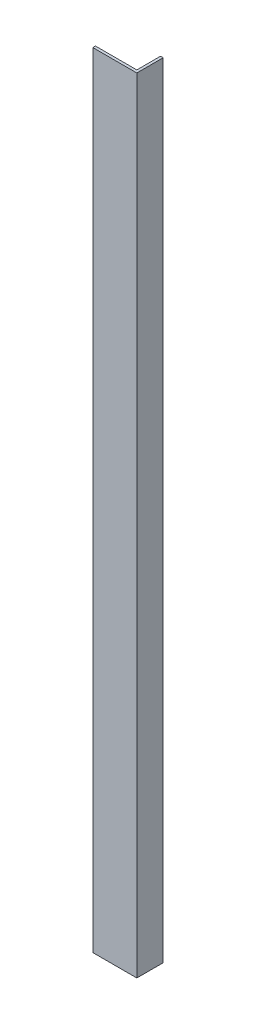
ISO-10303-21;
HEADER;
FILE_DESCRIPTION(('STEP AP214'),'2;1');
FILE_NAME('part.step','',(''),(''),'','','');
FILE_SCHEMA(('AUTOMOTIVE_DESIGN { 1 0 10303 214 1 1 1 1 }'));
ENDSEC;
DATA;
#1=APPLICATION_CONTEXT('core data for automotive mechanical design processes');
#2=APPLICATION_PROTOCOL_DEFINITION('international standard','automotive_design',2000,#1);
#3=PRODUCT_CONTEXT('',#1,'mechanical');
#4=PRODUCT('Part','Part','',(#3));
#5=PRODUCT_RELATED_PRODUCT_CATEGORY('part','',(#4));
#6=PRODUCT_DEFINITION_FORMATION('','',#4);
#7=PRODUCT_DEFINITION_CONTEXT('part definition',#1,'design');
#8=PRODUCT_DEFINITION('design','',#6,#7);
#9=PRODUCT_DEFINITION_SHAPE('','',#8);
#10=(LENGTH_UNIT() NAMED_UNIT(*) SI_UNIT(.MILLI.,.METRE.));
#11=(NAMED_UNIT(*) PLANE_ANGLE_UNIT() SI_UNIT($,.RADIAN.));
#12=(NAMED_UNIT(*) SI_UNIT($,.STERADIAN.) SOLID_ANGLE_UNIT());
#13=UNCERTAINTY_MEASURE_WITH_UNIT(LENGTH_MEASURE(1.E-05),#10,'distance_accuracy_value','');
#14=(GEOMETRIC_REPRESENTATION_CONTEXT(3) GLOBAL_UNCERTAINTY_ASSIGNED_CONTEXT((#13)) GLOBAL_UNIT_ASSIGNED_CONTEXT((#10,
#11,#12)) REPRESENTATION_CONTEXT('',''));
#15=CARTESIAN_POINT('',(0.,0.,0.));
#16=DIRECTION('',(0.,0.,1.));
#17=DIRECTION('',(1.,0.,0.));
#18=AXIS2_PLACEMENT_3D('',#15,#16,#17);
#19=CARTESIAN_POINT('',(25.,890.,-15.));
#20=DIRECTION('',(-1.,0.,0.));
#21=DIRECTION('',(0.,0.,1.));
#22=AXIS2_PLACEMENT_3D('',#19,#20,#21);
#23=PLANE('',#22);
#24=DIRECTION('',(0.,0.,-1.));
#25=VECTOR('',#24,1.);
#26=CARTESIAN_POINT('',(25.,0.,-15.));
#27=LINE('',#26,#25);
#28=CARTESIAN_POINT('',(25.,0.,15.));
#29=VERTEX_POINT('',#28);
#30=CARTESIAN_POINT('',(25.,0.,-15.));
#31=VERTEX_POINT('',#30);
#32=EDGE_CURVE('E116',#29,#31,#27,.T.);
#33=ORIENTED_EDGE('',*,*,#32,.T.);
#34=DIRECTION('',(0.,-1.,0.));
#35=VECTOR('',#34,1.);
#36=CARTESIAN_POINT('',(25.,890.,-15.));
#37=LINE('',#36,#35);
#38=CARTESIAN_POINT('',(25.,890.,-15.));
#39=VERTEX_POINT('',#38);
#40=EDGE_CURVE('E11',#39,#31,#37,.T.);
#41=ORIENTED_EDGE('',*,*,#40,.F.);
#42=DIRECTION('',(0.,0.,-1.));
#43=VECTOR('',#42,1.);
#44=CARTESIAN_POINT('',(25.,890.,-15.));
#45=LINE('',#44,#43);
#46=CARTESIAN_POINT('',(25.,890.,15.));
#47=VERTEX_POINT('',#46);
#48=EDGE_CURVE('E128',#47,#39,#45,.T.);
#49=ORIENTED_EDGE('',*,*,#48,.F.);
#50=DIRECTION('',(0.,-1.,0.));
#51=VECTOR('',#50,1.);
#52=CARTESIAN_POINT('',(25.,890.,15.));
#53=LINE('',#52,#51);
#54=EDGE_CURVE('E112',#47,#29,#53,.T.);
#55=ORIENTED_EDGE('',*,*,#54,.T.);
#56=EDGE_LOOP('',(#33,#41,#49,#55));
#57=FACE_BOUND('',#56,.T.);
#58=ADVANCED_FACE('F33',(#57),#23,.F.);
#59=CARTESIAN_POINT('',(22.,890.,-15.));
#60=DIRECTION('',(0.,0.,1.));
#61=DIRECTION('',(1.,0.,0.));
#62=AXIS2_PLACEMENT_3D('',#59,#60,#61);
#63=PLANE('',#62);
#64=DIRECTION('',(-1.,0.,0.));
#65=VECTOR('',#64,1.);
#66=CARTESIAN_POINT('',(22.,0.,-15.));
#67=LINE('',#66,#65);
#68=CARTESIAN_POINT('',(22.,0.,-15.));
#69=VERTEX_POINT('',#68);
#70=EDGE_CURVE('E119',#31,#69,#67,.T.);
#71=ORIENTED_EDGE('',*,*,#70,.T.);
#72=DIRECTION('',(0.,-1.,0.));
#73=VECTOR('',#72,1.);
#74=CARTESIAN_POINT('',(22.,890.,-15.));
#75=LINE('',#74,#73);
#76=CARTESIAN_POINT('',(22.,890.,-15.));
#77=VERTEX_POINT('',#76);
#78=EDGE_CURVE('E41',#77,#69,#75,.T.);
#79=ORIENTED_EDGE('',*,*,#78,.F.);
#80=DIRECTION('',(-1.,0.,0.));
#81=VECTOR('',#80,1.);
#82=CARTESIAN_POINT('',(22.,890.,-15.));
#83=LINE('',#82,#81);
#84=EDGE_CURVE('E86',#39,#77,#83,.T.);
#85=ORIENTED_EDGE('',*,*,#84,.F.);
#86=ORIENTED_EDGE('',*,*,#40,.T.);
#87=EDGE_LOOP('',(#71,#79,#85,#86));
#88=FACE_BOUND('',#87,.T.);
#89=ADVANCED_FACE('F134',(#88),#63,.F.);
#90=CARTESIAN_POINT('',(22.,890.,-12.));
#91=DIRECTION('',(1.,0.,0.));
#92=DIRECTION('',(0.,0.,-1.));
#93=AXIS2_PLACEMENT_3D('',#90,#91,#92);
#94=PLANE('',#93);
#95=DIRECTION('',(0.,0.,1.));
#96=VECTOR('',#95,1.);
#97=CARTESIAN_POINT('',(22.,0.,-12.));
#98=LINE('',#97,#96);
#99=CARTESIAN_POINT('',(22.,0.,12.));
#100=VERTEX_POINT('',#99);
#101=EDGE_CURVE('E122',#69,#100,#98,.T.);
#102=ORIENTED_EDGE('',*,*,#101,.T.);
#103=DIRECTION('',(0.,-1.,0.));
#104=VECTOR('',#103,1.);
#105=CARTESIAN_POINT('',(22.,890.,12.));
#106=LINE('',#105,#104);
#107=CARTESIAN_POINT('',(22.,890.,12.));
#108=VERTEX_POINT('',#107);
#109=EDGE_CURVE('E107',#108,#100,#106,.T.);
#110=ORIENTED_EDGE('',*,*,#109,.F.);
#111=DIRECTION('',(0.,0.,1.));
#112=VECTOR('',#111,1.);
#113=CARTESIAN_POINT('',(22.,890.,-12.));
#114=LINE('',#113,#112);
#115=EDGE_CURVE('E99',#77,#108,#114,.T.);
#116=ORIENTED_EDGE('',*,*,#115,.F.);
#117=ORIENTED_EDGE('',*,*,#78,.T.);
#118=EDGE_LOOP('',(#102,#110,#116,#117));
#119=FACE_BOUND('',#118,.T.);
#120=ADVANCED_FACE('F133',(#119),#94,.F.);
#121=CARTESIAN_POINT('',(-22.,890.,12.));
#122=DIRECTION('',(0.,0.,1.));
#123=DIRECTION('',(1.,0.,0.));
#124=AXIS2_PLACEMENT_3D('',#121,#122,#123);
#125=PLANE('',#124);
#126=DIRECTION('',(-1.,0.,0.));
#127=VECTOR('',#126,1.);
#128=CARTESIAN_POINT('',(-22.,0.,12.));
#129=LINE('',#128,#127);
#130=CARTESIAN_POINT('',(-25.,0.,12.));
#131=VERTEX_POINT('',#130);
#132=EDGE_CURVE('E106',#100,#131,#129,.T.);
#133=ORIENTED_EDGE('',*,*,#132,.T.);
#134=DIRECTION('',(0.,-1.,0.));
#135=VECTOR('',#134,1.);
#136=CARTESIAN_POINT('',(-25.,890.,12.));
#137=LINE('',#136,#135);
#138=CARTESIAN_POINT('',(-25.,890.,12.));
#139=VERTEX_POINT('',#138);
#140=EDGE_CURVE('E104',#139,#131,#137,.T.);
#141=ORIENTED_EDGE('',*,*,#140,.F.);
#142=DIRECTION('',(-1.,0.,0.));
#143=VECTOR('',#142,1.);
#144=CARTESIAN_POINT('',(-22.,890.,12.));
#145=LINE('',#144,#143);
#146=EDGE_CURVE('E93',#108,#139,#145,.T.);
#147=ORIENTED_EDGE('',*,*,#146,.F.);
#148=ORIENTED_EDGE('',*,*,#109,.T.);
#149=EDGE_LOOP('',(#133,#141,#147,#148));
#150=FACE_BOUND('',#149,.T.);
#151=ADVANCED_FACE('F105',(#150),#125,.F.);
#152=CARTESIAN_POINT('',(-25.,890.,12.));
#153=DIRECTION('',(1.,0.,0.));
#154=DIRECTION('',(0.,0.,-1.));
#155=AXIS2_PLACEMENT_3D('',#152,#153,#154);
#156=PLANE('',#155);
#157=DIRECTION('',(0.,0.,1.));
#158=VECTOR('',#157,1.);
#159=CARTESIAN_POINT('',(-25.,0.,12.));
#160=LINE('',#159,#158);
#161=CARTESIAN_POINT('',(-25.,0.,15.));
#162=VERTEX_POINT('',#161);
#163=EDGE_CURVE('E72',#131,#162,#160,.T.);
#164=ORIENTED_EDGE('',*,*,#163,.T.);
#165=DIRECTION('',(0.,-1.,0.));
#166=VECTOR('',#165,1.);
#167=CARTESIAN_POINT('',(-25.,890.,15.));
#168=LINE('',#167,#166);
#169=CARTESIAN_POINT('',(-25.,890.,15.));
#170=VERTEX_POINT('',#169);
#171=EDGE_CURVE('E108',#170,#162,#168,.T.);
#172=ORIENTED_EDGE('',*,*,#171,.F.);
#173=DIRECTION('',(0.,0.,1.));
#174=VECTOR('',#173,1.);
#175=CARTESIAN_POINT('',(-25.,890.,12.));
#176=LINE('',#175,#174);
#177=EDGE_CURVE('E97',#139,#170,#176,.T.);
#178=ORIENTED_EDGE('',*,*,#177,.F.);
#179=ORIENTED_EDGE('',*,*,#140,.T.);
#180=EDGE_LOOP('',(#164,#172,#178,#179));
#181=FACE_BOUND('',#180,.T.);
#182=ADVANCED_FACE('F110',(#181),#156,.F.);
#183=CARTESIAN_POINT('',(-25.,890.,15.));
#184=DIRECTION('',(0.,0.,-1.));
#185=DIRECTION('',(-1.,0.,0.));
#186=AXIS2_PLACEMENT_3D('',#183,#184,#185);
#187=PLANE('',#186);
#188=DIRECTION('',(1.,0.,0.));
#189=VECTOR('',#188,1.);
#190=CARTESIAN_POINT('',(-25.,0.,15.));
#191=LINE('',#190,#189);
#192=EDGE_CURVE('E78',#162,#29,#191,.T.);
#193=ORIENTED_EDGE('',*,*,#192,.T.);
#194=ORIENTED_EDGE('',*,*,#54,.F.);
#195=DIRECTION('',(1.,0.,0.));
#196=VECTOR('',#195,1.);
#197=CARTESIAN_POINT('',(-25.,890.,15.));
#198=LINE('',#197,#196);
#199=EDGE_CURVE('E49',#170,#47,#198,.T.);
#200=ORIENTED_EDGE('',*,*,#199,.F.);
#201=ORIENTED_EDGE('',*,*,#171,.T.);
#202=EDGE_LOOP('',(#193,#194,#200,#201));
#203=FACE_BOUND('',#202,.T.);
#204=ADVANCED_FACE('F141',(#203),#187,.F.);
#205=CARTESIAN_POINT('',(0.,890.,0.));
#206=DIRECTION('',(0.,1.,0.));
#207=DIRECTION('',(0.,0.,1.));
#208=AXIS2_PLACEMENT_3D('',#205,#206,#207);
#209=PLANE('',#208);
#210=ORIENTED_EDGE('',*,*,#48,.T.);
#211=ORIENTED_EDGE('',*,*,#84,.T.);
#212=ORIENTED_EDGE('',*,*,#115,.T.);
#213=ORIENTED_EDGE('',*,*,#146,.T.);
#214=ORIENTED_EDGE('',*,*,#177,.T.);
#215=ORIENTED_EDGE('',*,*,#199,.T.);
#216=EDGE_LOOP('',(#210,#211,#212,#213,#214,#215));
#217=FACE_BOUND('',#216,.T.);
#218=ADVANCED_FACE('F95',(#217),#209,.T.);
#219=CARTESIAN_POINT('',(0.,0.,0.));
#220=DIRECTION('',(0.,1.,0.));
#221=DIRECTION('',(0.,0.,1.));
#222=AXIS2_PLACEMENT_3D('',#219,#220,#221);
#223=PLANE('',#222);
#224=ORIENTED_EDGE('',*,*,#32,.F.);
#225=ORIENTED_EDGE('',*,*,#192,.F.);
#226=ORIENTED_EDGE('',*,*,#163,.F.);
#227=ORIENTED_EDGE('',*,*,#132,.F.);
#228=ORIENTED_EDGE('',*,*,#101,.F.);
#229=ORIENTED_EDGE('',*,*,#70,.F.);
#230=EDGE_LOOP('',(#224,#225,#226,#227,#228,#229));
#231=FACE_BOUND('',#230,.T.);
#232=ADVANCED_FACE('F138',(#231),#223,.F.);
#233=CLOSED_SHELL('',(#58,#89,#120,#151,#182,#204,#218,#232));
#234=MANIFOLD_SOLID_BREP('B2',#233);
#235=ADVANCED_BREP_SHAPE_REPRESENTATION('',(#18,#234),#14);
#236=SHAPE_DEFINITION_REPRESENTATION(#9,#235);
ENDSEC;
END-ISO-10303-21;
